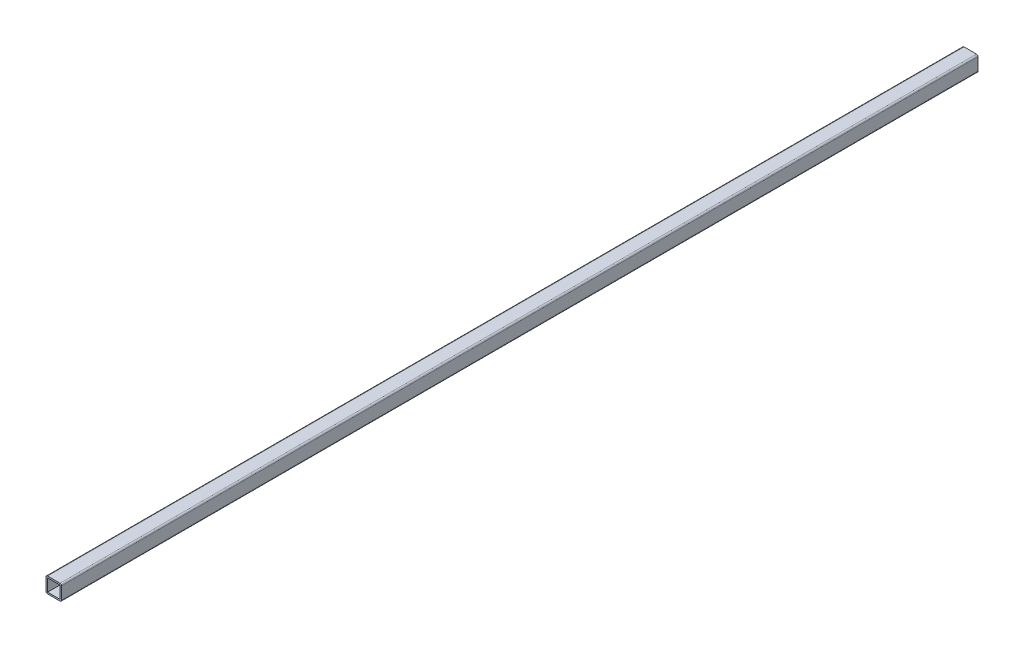
ISO-10303-21;
HEADER;
FILE_DESCRIPTION(('STEP AP214'),'2;1');
FILE_NAME('part.step','',(''),(''),'','','');
FILE_SCHEMA(('AUTOMOTIVE_DESIGN { 1 0 10303 214 1 1 1 1 }'));
ENDSEC;
DATA;
#1=APPLICATION_CONTEXT('core data for automotive mechanical design processes');
#2=APPLICATION_PROTOCOL_DEFINITION('international standard','automotive_design',2000,#1);
#3=PRODUCT_CONTEXT('',#1,'mechanical');
#4=PRODUCT('Part','Part','',(#3));
#5=PRODUCT_RELATED_PRODUCT_CATEGORY('part','',(#4));
#6=PRODUCT_DEFINITION_FORMATION('','',#4);
#7=PRODUCT_DEFINITION_CONTEXT('part definition',#1,'design');
#8=PRODUCT_DEFINITION('design','',#6,#7);
#9=PRODUCT_DEFINITION_SHAPE('','',#8);
#10=(LENGTH_UNIT() NAMED_UNIT(*) SI_UNIT(.MILLI.,.METRE.));
#11=(NAMED_UNIT(*) PLANE_ANGLE_UNIT() SI_UNIT($,.RADIAN.));
#12=(NAMED_UNIT(*) SI_UNIT($,.STERADIAN.) SOLID_ANGLE_UNIT());
#13=UNCERTAINTY_MEASURE_WITH_UNIT(LENGTH_MEASURE(1.E-05),#10,'distance_accuracy_value','');
#14=(GEOMETRIC_REPRESENTATION_CONTEXT(3) GLOBAL_UNCERTAINTY_ASSIGNED_CONTEXT((#13)) GLOBAL_UNIT_ASSIGNED_CONTEXT((#10,
#11,#12)) REPRESENTATION_CONTEXT('',''));
#15=CARTESIAN_POINT('',(0.,0.,0.));
#16=DIRECTION('',(0.,0.,1.));
#17=DIRECTION('',(1.,0.,0.));
#18=AXIS2_PLACEMENT_3D('',#15,#16,#17);
#19=CARTESIAN_POINT('',(-10.16,-10.16,1500.));
#20=DIRECTION('',(0.,0.,1.));
#21=DIRECTION('',(1.,0.,0.));
#22=AXIS2_PLACEMENT_3D('',#19,#20,#21);
#23=PLANE('',#22);
#24=CARTESIAN_POINT('',(-10.16,-10.16,1500.));
#25=DIRECTION('',(0.,0.,1.));
#26=DIRECTION('',(1.,0.,0.));
#27=AXIS2_PLACEMENT_3D('',#24,#25,#26);
#28=CIRCLE('',#27,2.54);
#29=CARTESIAN_POINT('',(-12.7,-10.16,1500.));
#30=VERTEX_POINT('',#29);
#31=CARTESIAN_POINT('',(-10.16,-12.7,1500.));
#32=VERTEX_POINT('',#31);
#33=EDGE_CURVE('E177',#30,#32,#28,.T.);
#34=ORIENTED_EDGE('',*,*,#33,.T.);
#35=DIRECTION('',(1.,0.,0.));
#36=VECTOR('',#35,1.);
#37=CARTESIAN_POINT('',(-10.16,-12.7,1500.));
#38=LINE('',#37,#36);
#39=CARTESIAN_POINT('',(10.16,-12.7,1500.));
#40=VERTEX_POINT('',#39);
#41=EDGE_CURVE('E181',#32,#40,#38,.T.);
#42=ORIENTED_EDGE('',*,*,#41,.T.);
#43=CARTESIAN_POINT('',(10.16,-10.16,1500.));
#44=DIRECTION('',(0.,0.,1.));
#45=DIRECTION('',(1.,0.,0.));
#46=AXIS2_PLACEMENT_3D('',#43,#44,#45);
#47=CIRCLE('',#46,2.54);
#48=CARTESIAN_POINT('',(12.7,-10.16,1500.));
#49=VERTEX_POINT('',#48);
#50=EDGE_CURVE('E185',#40,#49,#47,.T.);
#51=ORIENTED_EDGE('',*,*,#50,.T.);
#52=DIRECTION('',(0.,1.,0.));
#53=VECTOR('',#52,1.);
#54=CARTESIAN_POINT('',(12.7,10.16,1500.));
#55=LINE('',#54,#53);
#56=CARTESIAN_POINT('',(12.7,10.16,1500.));
#57=VERTEX_POINT('',#56);
#58=EDGE_CURVE('E188',#49,#57,#55,.T.);
#59=ORIENTED_EDGE('',*,*,#58,.T.);
#60=CARTESIAN_POINT('',(10.16,10.16,1500.));
#61=DIRECTION('',(0.,0.,1.));
#62=DIRECTION('',(-1.,0.,0.));
#63=AXIS2_PLACEMENT_3D('',#60,#61,#62);
#64=CIRCLE('',#63,2.54);
#65=CARTESIAN_POINT('',(10.16,12.7,1500.));
#66=VERTEX_POINT('',#65);
#67=EDGE_CURVE('E191',#57,#66,#64,.T.);
#68=ORIENTED_EDGE('',*,*,#67,.T.);
#69=DIRECTION('',(-1.,0.,0.));
#70=VECTOR('',#69,1.);
#71=CARTESIAN_POINT('',(-10.16,12.7,1500.));
#72=LINE('',#71,#70);
#73=CARTESIAN_POINT('',(-10.16,12.7,1500.));
#74=VERTEX_POINT('',#73);
#75=EDGE_CURVE('E194',#66,#74,#72,.T.);
#76=ORIENTED_EDGE('',*,*,#75,.T.);
#77=CARTESIAN_POINT('',(-10.16,10.16,1500.));
#78=DIRECTION('',(0.,0.,1.));
#79=DIRECTION('',(1.,0.,0.));
#80=AXIS2_PLACEMENT_3D('',#77,#78,#79);
#81=CIRCLE('',#80,2.54);
#82=CARTESIAN_POINT('',(-12.7,10.16,1500.));
#83=VERTEX_POINT('',#82);
#84=EDGE_CURVE('E197',#74,#83,#81,.T.);
#85=ORIENTED_EDGE('',*,*,#84,.T.);
#86=DIRECTION('',(0.,-1.,0.));
#87=VECTOR('',#86,1.);
#88=CARTESIAN_POINT('',(-12.7,10.16,1500.));
#89=LINE('',#88,#87);
#90=EDGE_CURVE('E200',#83,#30,#89,.T.);
#91=ORIENTED_EDGE('',*,*,#90,.T.);
#92=EDGE_LOOP('',(#34,#42,#51,#59,#68,#76,#85,#91));
#93=FACE_BOUND('',#92,.T.);
#94=DIRECTION('',(0.,-1.,0.));
#95=VECTOR('',#94,1.);
#96=CARTESIAN_POINT('',(-10.16,10.16,1500.));
#97=LINE('',#96,#95);
#98=CARTESIAN_POINT('',(-10.16,10.16,1500.));
#99=VERTEX_POINT('',#98);
#100=CARTESIAN_POINT('',(-10.16,-10.16,1500.));
#101=VERTEX_POINT('',#100);
#102=EDGE_CURVE('E138',#99,#101,#97,.T.);
#103=ORIENTED_EDGE('',*,*,#102,.F.);
#104=DIRECTION('',(-1.,0.,0.));
#105=VECTOR('',#104,1.);
#106=CARTESIAN_POINT('',(-10.16,10.16,1500.));
#107=LINE('',#106,#105);
#108=CARTESIAN_POINT('',(10.16,10.16,1500.));
#109=VERTEX_POINT('',#108);
#110=EDGE_CURVE('E129',#109,#99,#107,.T.);
#111=ORIENTED_EDGE('',*,*,#110,.F.);
#112=DIRECTION('',(0.,1.,0.));
#113=VECTOR('',#112,1.);
#114=CARTESIAN_POINT('',(10.16,10.16,1500.));
#115=LINE('',#114,#113);
#116=CARTESIAN_POINT('',(10.16,-10.16,1500.));
#117=VERTEX_POINT('',#116);
#118=EDGE_CURVE('E155',#117,#109,#115,.T.);
#119=ORIENTED_EDGE('',*,*,#118,.F.);
#120=DIRECTION('',(1.,0.,0.));
#121=VECTOR('',#120,1.);
#122=CARTESIAN_POINT('',(-10.16,-10.16,1500.));
#123=LINE('',#122,#121);
#124=EDGE_CURVE('E151',#101,#117,#123,.T.);
#125=ORIENTED_EDGE('',*,*,#124,.F.);
#126=EDGE_LOOP('',(#103,#111,#119,#125));
#127=FACE_BOUND('',#126,.T.);
#128=ADVANCED_FACE('F39',(#93,#127),#23,.T.);
#129=CARTESIAN_POINT('',(-10.16,-10.16,0.));
#130=DIRECTION('',(0.,0.,1.));
#131=DIRECTION('',(1.,0.,0.));
#132=AXIS2_PLACEMENT_3D('',#129,#130,#131);
#133=PLANE('',#132);
#134=CARTESIAN_POINT('',(-10.16,-10.16,0.));
#135=DIRECTION('',(0.,0.,1.));
#136=DIRECTION('',(1.,0.,0.));
#137=AXIS2_PLACEMENT_3D('',#134,#135,#136);
#138=CIRCLE('',#137,2.54);
#139=CARTESIAN_POINT('',(-12.7,-10.16,0.));
#140=VERTEX_POINT('',#139);
#141=CARTESIAN_POINT('',(-10.16,-12.7,0.));
#142=VERTEX_POINT('',#141);
#143=EDGE_CURVE('E147',#140,#142,#138,.T.);
#144=ORIENTED_EDGE('',*,*,#143,.F.);
#145=DIRECTION('',(0.,-1.,0.));
#146=VECTOR('',#145,1.);
#147=CARTESIAN_POINT('',(-12.7,10.16,0.));
#148=LINE('',#147,#146);
#149=CARTESIAN_POINT('',(-12.7,10.16,0.));
#150=VERTEX_POINT('',#149);
#151=EDGE_CURVE('E182',#150,#140,#148,.T.);
#152=ORIENTED_EDGE('',*,*,#151,.F.);
#153=CARTESIAN_POINT('',(-10.16,10.16,0.));
#154=DIRECTION('',(0.,0.,1.));
#155=DIRECTION('',(1.,0.,0.));
#156=AXIS2_PLACEMENT_3D('',#153,#154,#155);
#157=CIRCLE('',#156,2.54);
#158=CARTESIAN_POINT('',(-10.16,12.7,0.));
#159=VERTEX_POINT('',#158);
#160=EDGE_CURVE('E222',#159,#150,#157,.T.);
#161=ORIENTED_EDGE('',*,*,#160,.F.);
#162=DIRECTION('',(-1.,0.,0.));
#163=VECTOR('',#162,1.);
#164=CARTESIAN_POINT('',(-10.16,12.7,0.));
#165=LINE('',#164,#163);
#166=CARTESIAN_POINT('',(10.16,12.7,0.));
#167=VERTEX_POINT('',#166);
#168=EDGE_CURVE('E219',#167,#159,#165,.T.);
#169=ORIENTED_EDGE('',*,*,#168,.F.);
#170=CARTESIAN_POINT('',(10.16,10.16,0.));
#171=DIRECTION('',(0.,0.,1.));
#172=DIRECTION('',(-1.,0.,0.));
#173=AXIS2_PLACEMENT_3D('',#170,#171,#172);
#174=CIRCLE('',#173,2.54);
#175=CARTESIAN_POINT('',(12.7,10.16,0.));
#176=VERTEX_POINT('',#175);
#177=EDGE_CURVE('E216',#176,#167,#174,.T.);
#178=ORIENTED_EDGE('',*,*,#177,.F.);
#179=DIRECTION('',(0.,1.,0.));
#180=VECTOR('',#179,1.);
#181=CARTESIAN_POINT('',(12.7,10.16,0.));
#182=LINE('',#181,#180);
#183=CARTESIAN_POINT('',(12.7,-10.16,0.));
#184=VERTEX_POINT('',#183);
#185=EDGE_CURVE('E213',#184,#176,#182,.T.);
#186=ORIENTED_EDGE('',*,*,#185,.F.);
#187=CARTESIAN_POINT('',(10.16,-10.16,0.));
#188=DIRECTION('',(0.,0.,1.));
#189=DIRECTION('',(1.,0.,0.));
#190=AXIS2_PLACEMENT_3D('',#187,#188,#189);
#191=CIRCLE('',#190,2.54);
#192=CARTESIAN_POINT('',(10.16,-12.7,0.));
#193=VERTEX_POINT('',#192);
#194=EDGE_CURVE('E210',#193,#184,#191,.T.);
#195=ORIENTED_EDGE('',*,*,#194,.F.);
#196=DIRECTION('',(1.,0.,0.));
#197=VECTOR('',#196,1.);
#198=CARTESIAN_POINT('',(-10.16,-12.7,0.));
#199=LINE('',#198,#197);
#200=EDGE_CURVE('E207',#142,#193,#199,.T.);
#201=ORIENTED_EDGE('',*,*,#200,.F.);
#202=EDGE_LOOP('',(#144,#152,#161,#169,#178,#186,#195,#201));
#203=FACE_BOUND('',#202,.T.);
#204=DIRECTION('',(-1.,0.,0.));
#205=VECTOR('',#204,1.);
#206=CARTESIAN_POINT('',(-10.16,10.16,0.));
#207=LINE('',#206,#205);
#208=CARTESIAN_POINT('',(10.16,10.16,0.));
#209=VERTEX_POINT('',#208);
#210=CARTESIAN_POINT('',(-10.16,10.16,0.));
#211=VERTEX_POINT('',#210);
#212=EDGE_CURVE('E63',#209,#211,#207,.T.);
#213=ORIENTED_EDGE('',*,*,#212,.T.);
#214=DIRECTION('',(0.,-1.,0.));
#215=VECTOR('',#214,1.);
#216=CARTESIAN_POINT('',(-10.16,10.16,0.));
#217=LINE('',#216,#215);
#218=CARTESIAN_POINT('',(-10.16,-10.16,0.));
#219=VERTEX_POINT('',#218);
#220=EDGE_CURVE('E145',#211,#219,#217,.T.);
#221=ORIENTED_EDGE('',*,*,#220,.T.);
#222=DIRECTION('',(1.,0.,0.));
#223=VECTOR('',#222,1.);
#224=CARTESIAN_POINT('',(-10.16,-10.16,0.));
#225=LINE('',#224,#223);
#226=CARTESIAN_POINT('',(10.16,-10.16,0.));
#227=VERTEX_POINT('',#226);
#228=EDGE_CURVE('E164',#219,#227,#225,.T.);
#229=ORIENTED_EDGE('',*,*,#228,.T.);
#230=DIRECTION('',(0.,1.,0.));
#231=VECTOR('',#230,1.);
#232=CARTESIAN_POINT('',(10.16,10.16,0.));
#233=LINE('',#232,#231);
#234=EDGE_CURVE('E139',#227,#209,#233,.T.);
#235=ORIENTED_EDGE('',*,*,#234,.T.);
#236=EDGE_LOOP('',(#213,#221,#229,#235));
#237=FACE_BOUND('',#236,.T.);
#238=ADVANCED_FACE('F261',(#203,#237),#133,.F.);
#239=CARTESIAN_POINT('',(-10.16,-10.16,1500.));
#240=DIRECTION('',(0.,0.,-1.));
#241=DIRECTION('',(-1.,0.,0.));
#242=AXIS2_PLACEMENT_3D('',#239,#240,#241);
#243=CYLINDRICAL_SURFACE('',#242,2.54);
#244=ORIENTED_EDGE('',*,*,#143,.T.);
#245=DIRECTION('',(0.,0.,-1.));
#246=VECTOR('',#245,1.);
#247=CARTESIAN_POINT('',(-10.16,-12.7,1500.));
#248=LINE('',#247,#246);
#249=EDGE_CURVE('E11',#32,#142,#248,.T.);
#250=ORIENTED_EDGE('',*,*,#249,.F.);
#251=ORIENTED_EDGE('',*,*,#33,.F.);
#252=DIRECTION('',(0.,0.,-1.));
#253=VECTOR('',#252,1.);
#254=CARTESIAN_POINT('',(-12.7,-10.16,1500.));
#255=LINE('',#254,#253);
#256=EDGE_CURVE('E203',#30,#140,#255,.T.);
#257=ORIENTED_EDGE('',*,*,#256,.T.);
#258=EDGE_LOOP('',(#244,#250,#251,#257));
#259=FACE_BOUND('',#258,.T.);
#260=ADVANCED_FACE('F41',(#259),#243,.T.);
#261=CARTESIAN_POINT('',(-10.16,-12.7,1500.));
#262=DIRECTION('',(0.,1.,0.));
#263=DIRECTION('',(0.,0.,1.));
#264=AXIS2_PLACEMENT_3D('',#261,#262,#263);
#265=PLANE('',#264);
#266=ORIENTED_EDGE('',*,*,#200,.T.);
#267=DIRECTION('',(0.,0.,-1.));
#268=VECTOR('',#267,1.);
#269=CARTESIAN_POINT('',(10.16,-12.7,1500.));
#270=LINE('',#269,#268);
#271=EDGE_CURVE('E48',#40,#193,#270,.T.);
#272=ORIENTED_EDGE('',*,*,#271,.F.);
#273=ORIENTED_EDGE('',*,*,#41,.F.);
#274=ORIENTED_EDGE('',*,*,#249,.T.);
#275=EDGE_LOOP('',(#266,#272,#273,#274));
#276=FACE_BOUND('',#275,.T.);
#277=ADVANCED_FACE('F278',(#276),#265,.F.);
#278=CARTESIAN_POINT('',(10.16,-10.16,1500.));
#279=DIRECTION('',(0.,0.,-1.));
#280=DIRECTION('',(-1.,0.,0.));
#281=AXIS2_PLACEMENT_3D('',#278,#279,#280);
#282=CYLINDRICAL_SURFACE('',#281,2.54);
#283=ORIENTED_EDGE('',*,*,#194,.T.);
#284=DIRECTION('',(0.,0.,-1.));
#285=VECTOR('',#284,1.);
#286=CARTESIAN_POINT('',(12.7,-10.16,1500.));
#287=LINE('',#286,#285);
#288=EDGE_CURVE('E246',#49,#184,#287,.T.);
#289=ORIENTED_EDGE('',*,*,#288,.F.);
#290=ORIENTED_EDGE('',*,*,#50,.F.);
#291=ORIENTED_EDGE('',*,*,#271,.T.);
#292=EDGE_LOOP('',(#283,#289,#290,#291));
#293=FACE_BOUND('',#292,.T.);
#294=ADVANCED_FACE('F255',(#293),#282,.T.);
#295=CARTESIAN_POINT('',(12.7,10.16,1500.));
#296=DIRECTION('',(-1.,0.,0.));
#297=DIRECTION('',(0.,-1.,0.));
#298=AXIS2_PLACEMENT_3D('',#295,#296,#297);
#299=PLANE('',#298);
#300=ORIENTED_EDGE('',*,*,#185,.T.);
#301=DIRECTION('',(0.,0.,-1.));
#302=VECTOR('',#301,1.);
#303=CARTESIAN_POINT('',(12.7,10.16,1500.));
#304=LINE('',#303,#302);
#305=EDGE_CURVE('E242',#57,#176,#304,.T.);
#306=ORIENTED_EDGE('',*,*,#305,.F.);
#307=ORIENTED_EDGE('',*,*,#58,.F.);
#308=ORIENTED_EDGE('',*,*,#288,.T.);
#309=EDGE_LOOP('',(#300,#306,#307,#308));
#310=FACE_BOUND('',#309,.T.);
#311=ADVANCED_FACE('F267',(#310),#299,.F.);
#312=CARTESIAN_POINT('',(10.16,10.16,1500.));
#313=DIRECTION('',(0.,0.,-1.));
#314=DIRECTION('',(-1.,0.,0.));
#315=AXIS2_PLACEMENT_3D('',#312,#313,#314);
#316=CYLINDRICAL_SURFACE('',#315,2.54);
#317=ORIENTED_EDGE('',*,*,#177,.T.);
#318=DIRECTION('',(0.,0.,-1.));
#319=VECTOR('',#318,1.);
#320=CARTESIAN_POINT('',(10.16,12.7,1500.));
#321=LINE('',#320,#319);
#322=EDGE_CURVE('E238',#66,#167,#321,.T.);
#323=ORIENTED_EDGE('',*,*,#322,.F.);
#324=ORIENTED_EDGE('',*,*,#67,.F.);
#325=ORIENTED_EDGE('',*,*,#305,.T.);
#326=EDGE_LOOP('',(#317,#323,#324,#325));
#327=FACE_BOUND('',#326,.T.);
#328=ADVANCED_FACE('F271',(#327),#316,.T.);
#329=CARTESIAN_POINT('',(-10.16,12.7,1500.));
#330=DIRECTION('',(0.,-1.,0.));
#331=DIRECTION('',(0.,0.,-1.));
#332=AXIS2_PLACEMENT_3D('',#329,#330,#331);
#333=PLANE('',#332);
#334=ORIENTED_EDGE('',*,*,#168,.T.);
#335=DIRECTION('',(0.,0.,-1.));
#336=VECTOR('',#335,1.);
#337=CARTESIAN_POINT('',(-10.16,12.7,1500.));
#338=LINE('',#337,#336);
#339=EDGE_CURVE('E234',#74,#159,#338,.T.);
#340=ORIENTED_EDGE('',*,*,#339,.F.);
#341=ORIENTED_EDGE('',*,*,#75,.F.);
#342=ORIENTED_EDGE('',*,*,#322,.T.);
#343=EDGE_LOOP('',(#334,#340,#341,#342));
#344=FACE_BOUND('',#343,.T.);
#345=ADVANCED_FACE('F291',(#344),#333,.F.);
#346=CARTESIAN_POINT('',(-10.16,10.16,1500.));
#347=DIRECTION('',(0.,0.,-1.));
#348=DIRECTION('',(-1.,0.,0.));
#349=AXIS2_PLACEMENT_3D('',#346,#347,#348);
#350=CYLINDRICAL_SURFACE('',#349,2.54);
#351=ORIENTED_EDGE('',*,*,#160,.T.);
#352=DIRECTION('',(0.,0.,-1.));
#353=VECTOR('',#352,1.);
#354=CARTESIAN_POINT('',(-12.7,10.16,1500.));
#355=LINE('',#354,#353);
#356=EDGE_CURVE('E230',#83,#150,#355,.T.);
#357=ORIENTED_EDGE('',*,*,#356,.F.);
#358=ORIENTED_EDGE('',*,*,#84,.F.);
#359=ORIENTED_EDGE('',*,*,#339,.T.);
#360=EDGE_LOOP('',(#351,#357,#358,#359));
#361=FACE_BOUND('',#360,.T.);
#362=ADVANCED_FACE('F289',(#361),#350,.T.);
#363=CARTESIAN_POINT('',(-12.7,10.16,1500.));
#364=DIRECTION('',(1.,0.,0.));
#365=DIRECTION('',(0.,1.,0.));
#366=AXIS2_PLACEMENT_3D('',#363,#364,#365);
#367=PLANE('',#366);
#368=ORIENTED_EDGE('',*,*,#151,.T.);
#369=ORIENTED_EDGE('',*,*,#256,.F.);
#370=ORIENTED_EDGE('',*,*,#90,.F.);
#371=ORIENTED_EDGE('',*,*,#356,.T.);
#372=EDGE_LOOP('',(#368,#369,#370,#371));
#373=FACE_BOUND('',#372,.T.);
#374=ADVANCED_FACE('F284',(#373),#367,.F.);
#375=CARTESIAN_POINT('',(-10.16,10.16,1500.));
#376=DIRECTION('',(0.,-1.,0.));
#377=DIRECTION('',(0.,0.,-1.));
#378=AXIS2_PLACEMENT_3D('',#375,#376,#377);
#379=PLANE('',#378);
#380=ORIENTED_EDGE('',*,*,#212,.F.);
#381=DIRECTION('',(0.,0.,-1.));
#382=VECTOR('',#381,1.);
#383=CARTESIAN_POINT('',(10.16,10.16,1500.));
#384=LINE('',#383,#382);
#385=EDGE_CURVE('E133',#109,#209,#384,.T.);
#386=ORIENTED_EDGE('',*,*,#385,.F.);
#387=ORIENTED_EDGE('',*,*,#110,.T.);
#388=DIRECTION('',(0.,0.,-1.));
#389=VECTOR('',#388,1.);
#390=CARTESIAN_POINT('',(-10.16,10.16,1500.));
#391=LINE('',#390,#389);
#392=EDGE_CURVE('E132',#99,#211,#391,.T.);
#393=ORIENTED_EDGE('',*,*,#392,.T.);
#394=EDGE_LOOP('',(#380,#386,#387,#393));
#395=FACE_BOUND('',#394,.T.);
#396=ADVANCED_FACE('F131',(#395),#379,.T.);
#397=CARTESIAN_POINT('',(-10.16,10.16,1500.));
#398=DIRECTION('',(1.,0.,0.));
#399=DIRECTION('',(0.,1.,0.));
#400=AXIS2_PLACEMENT_3D('',#397,#398,#399);
#401=PLANE('',#400);
#402=ORIENTED_EDGE('',*,*,#220,.F.);
#403=ORIENTED_EDGE('',*,*,#392,.F.);
#404=ORIENTED_EDGE('',*,*,#102,.T.);
#405=DIRECTION('',(0.,0.,-1.));
#406=VECTOR('',#405,1.);
#407=CARTESIAN_POINT('',(-10.16,-10.16,1500.));
#408=LINE('',#407,#406);
#409=EDGE_CURVE('E148',#101,#219,#408,.T.);
#410=ORIENTED_EDGE('',*,*,#409,.T.);
#411=EDGE_LOOP('',(#402,#403,#404,#410));
#412=FACE_BOUND('',#411,.T.);
#413=ADVANCED_FACE('F142',(#412),#401,.T.);
#414=CARTESIAN_POINT('',(-10.16,-10.16,1500.));
#415=DIRECTION('',(0.,1.,0.));
#416=DIRECTION('',(0.,0.,1.));
#417=AXIS2_PLACEMENT_3D('',#414,#415,#416);
#418=PLANE('',#417);
#419=ORIENTED_EDGE('',*,*,#228,.F.);
#420=ORIENTED_EDGE('',*,*,#409,.F.);
#421=ORIENTED_EDGE('',*,*,#124,.T.);
#422=DIRECTION('',(0.,0.,-1.));
#423=VECTOR('',#422,1.);
#424=CARTESIAN_POINT('',(10.16,-10.16,1500.));
#425=LINE('',#424,#423);
#426=EDGE_CURVE('E55',#117,#227,#425,.T.);
#427=ORIENTED_EDGE('',*,*,#426,.T.);
#428=EDGE_LOOP('',(#419,#420,#421,#427));
#429=FACE_BOUND('',#428,.T.);
#430=ADVANCED_FACE('F316',(#429),#418,.T.);
#431=CARTESIAN_POINT('',(10.16,10.16,1500.));
#432=DIRECTION('',(-1.,0.,0.));
#433=DIRECTION('',(0.,-1.,0.));
#434=AXIS2_PLACEMENT_3D('',#431,#432,#433);
#435=PLANE('',#434);
#436=ORIENTED_EDGE('',*,*,#234,.F.);
#437=ORIENTED_EDGE('',*,*,#426,.F.);
#438=ORIENTED_EDGE('',*,*,#118,.T.);
#439=ORIENTED_EDGE('',*,*,#385,.T.);
#440=EDGE_LOOP('',(#436,#437,#438,#439));
#441=FACE_BOUND('',#440,.T.);
#442=ADVANCED_FACE('F320',(#441),#435,.T.);
#443=CLOSED_SHELL('',(#128,#238,#260,#277,#294,#311,#328,#345,#362,#374,#396,#413,#430,#442));
#444=MANIFOLD_SOLID_BREP('B2',#443);
#445=ADVANCED_BREP_SHAPE_REPRESENTATION('',(#18,#444),#14);
#446=SHAPE_DEFINITION_REPRESENTATION(#9,#445);
ENDSEC;
END-ISO-10303-21;
